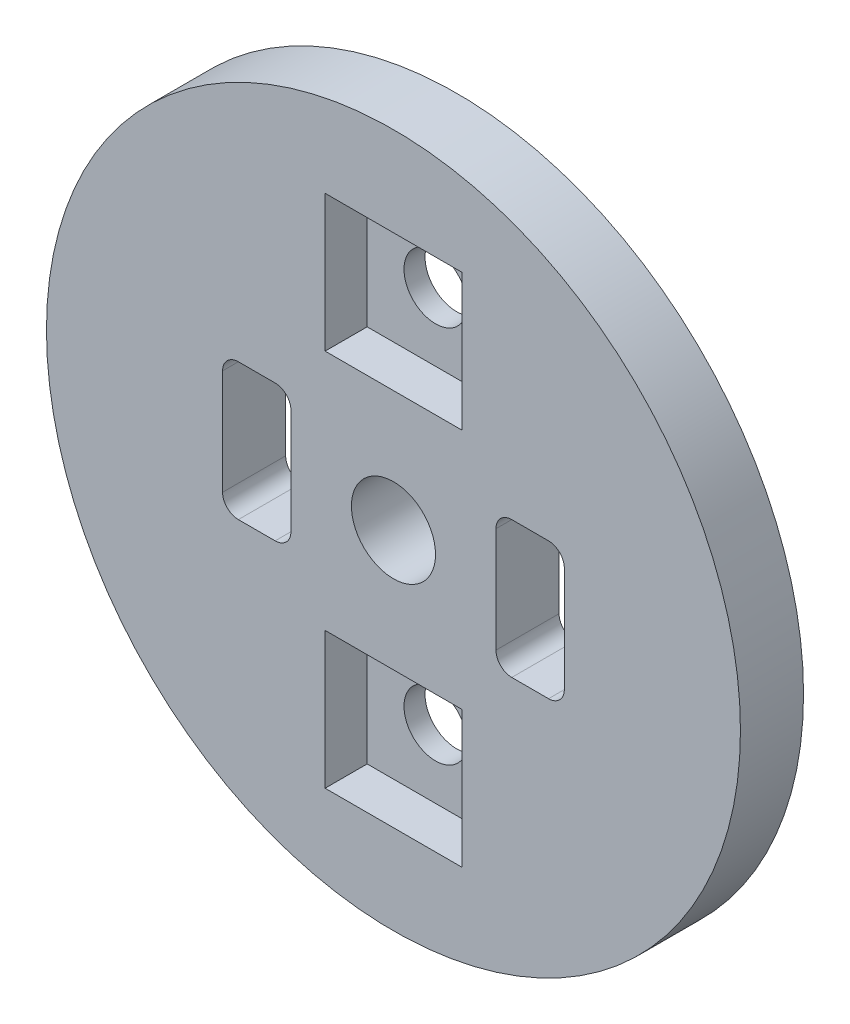
ISO-10303-21;
HEADER;
FILE_DESCRIPTION(('STEP AP214'),'2;1');
FILE_NAME('part.step','',(''),(''),'','','');
FILE_SCHEMA(('AUTOMOTIVE_DESIGN { 1 0 10303 214 1 1 1 1 }'));
ENDSEC;
DATA;
#1=APPLICATION_CONTEXT('core data for automotive mechanical design processes');
#2=APPLICATION_PROTOCOL_DEFINITION('international standard','automotive_design',2000,#1);
#3=PRODUCT_CONTEXT('',#1,'mechanical');
#4=PRODUCT('Part','Part','',(#3));
#5=PRODUCT_RELATED_PRODUCT_CATEGORY('part','',(#4));
#6=PRODUCT_DEFINITION_FORMATION('','',#4);
#7=PRODUCT_DEFINITION_CONTEXT('part definition',#1,'design');
#8=PRODUCT_DEFINITION('design','',#6,#7);
#9=PRODUCT_DEFINITION_SHAPE('','',#8);
#10=(LENGTH_UNIT() NAMED_UNIT(*) SI_UNIT(.MILLI.,.METRE.));
#11=(NAMED_UNIT(*) PLANE_ANGLE_UNIT() SI_UNIT($,.RADIAN.));
#12=(NAMED_UNIT(*) SI_UNIT($,.STERADIAN.) SOLID_ANGLE_UNIT());
#13=UNCERTAINTY_MEASURE_WITH_UNIT(LENGTH_MEASURE(1.E-05),#10,'distance_accuracy_value','');
#14=(GEOMETRIC_REPRESENTATION_CONTEXT(3) GLOBAL_UNCERTAINTY_ASSIGNED_CONTEXT((#13)) GLOBAL_UNIT_ASSIGNED_CONTEXT((#10,
#11,#12)) REPRESENTATION_CONTEXT('',''));
#15=CARTESIAN_POINT('',(0.,0.,0.));
#16=DIRECTION('',(0.,0.,1.));
#17=DIRECTION('',(1.,0.,0.));
#18=AXIS2_PLACEMENT_3D('',#15,#16,#17);
#19=CARTESIAN_POINT('',(215.7478079135,232.9520199932,3.));
#20=DIRECTION('',(0.,0.,-1.));
#21=DIRECTION('',(-1.,0.,0.));
#22=AXIS2_PLACEMENT_3D('',#19,#20,#21);
#23=CYLINDRICAL_SURFACE('',#22,1.5);
#24=CARTESIAN_POINT('',(215.7478079135,232.9520199932,0.));
#25=DIRECTION('',(0.,0.,1.));
#26=DIRECTION('',(1.,0.,0.));
#27=AXIS2_PLACEMENT_3D('',#24,#25,#26);
#28=CIRCLE('',#27,1.5);
#29=CARTESIAN_POINT('',(217.2478079135,232.9520199932,0.));
#30=VERTEX_POINT('',#29);
#31=EDGE_CURVE('E304',#30,#30,#28,.T.);
#32=ORIENTED_EDGE('',*,*,#31,.F.);
#33=EDGE_LOOP('',(#32));
#34=FACE_BOUND('',#33,.T.);
#35=CARTESIAN_POINT('',(215.7478079135,232.9520199932,1.));
#36=DIRECTION('',(0.,0.,1.));
#37=DIRECTION('',(1.,0.,0.));
#38=AXIS2_PLACEMENT_3D('',#35,#36,#37);
#39=CIRCLE('',#38,1.5);
#40=CARTESIAN_POINT('',(217.2478079135,232.9520199932,1.));
#41=VERTEX_POINT('',#40);
#42=EDGE_CURVE('E73',#41,#41,#39,.T.);
#43=ORIENTED_EDGE('',*,*,#42,.T.);
#44=EDGE_LOOP('',(#43));
#45=FACE_BOUND('',#44,.T.);
#46=ADVANCED_FACE('F69',(#34,#45),#23,.F.);
#47=CARTESIAN_POINT('',(215.7478079135,250.9520199932,3.));
#48=DIRECTION('',(0.,0.,-1.));
#49=DIRECTION('',(-1.,0.,0.));
#50=AXIS2_PLACEMENT_3D('',#47,#48,#49);
#51=CYLINDRICAL_SURFACE('',#50,1.5);
#52=CARTESIAN_POINT('',(215.7478079135,250.9520199932,0.));
#53=DIRECTION('',(0.,0.,1.));
#54=DIRECTION('',(1.,0.,0.));
#55=AXIS2_PLACEMENT_3D('',#52,#53,#54);
#56=CIRCLE('',#55,1.5);
#57=CARTESIAN_POINT('',(217.2478079135,250.9520199932,0.));
#58=VERTEX_POINT('',#57);
#59=EDGE_CURVE('E356',#58,#58,#56,.T.);
#60=ORIENTED_EDGE('',*,*,#59,.F.);
#61=EDGE_LOOP('',(#60));
#62=FACE_BOUND('',#61,.T.);
#63=CARTESIAN_POINT('',(215.7478079135,250.9520199932,1.));
#64=DIRECTION('',(0.,0.,1.));
#65=DIRECTION('',(1.,0.,0.));
#66=AXIS2_PLACEMENT_3D('',#63,#64,#65);
#67=CIRCLE('',#66,1.5);
#68=CARTESIAN_POINT('',(217.2478079135,250.9520199932,1.));
#69=VERTEX_POINT('',#68);
#70=EDGE_CURVE('E294',#69,#69,#67,.T.);
#71=ORIENTED_EDGE('',*,*,#70,.T.);
#72=EDGE_LOOP('',(#71));
#73=FACE_BOUND('',#72,.T.);
#74=ADVANCED_FACE('F71',(#62,#73),#51,.F.);
#75=CARTESIAN_POINT('',(215.7478079135,241.9520199932,3.));
#76=DIRECTION('',(0.,0.,-1.));
#77=DIRECTION('',(-1.,0.,0.));
#78=AXIS2_PLACEMENT_3D('',#75,#76,#77);
#79=CYLINDRICAL_SURFACE('',#78,16.5);
#80=CARTESIAN_POINT('',(215.7478079135,241.9520199932,3.));
#81=DIRECTION('',(0.,0.,1.));
#82=DIRECTION('',(1.,0.,0.));
#83=AXIS2_PLACEMENT_3D('',#80,#81,#82);
#84=CIRCLE('',#83,16.5);
#85=CARTESIAN_POINT('',(232.2478079135,241.9520199932,3.));
#86=VERTEX_POINT('',#85);
#87=EDGE_CURVE('E348',#86,#86,#84,.T.);
#88=ORIENTED_EDGE('',*,*,#87,.F.);
#89=EDGE_LOOP('',(#88));
#90=FACE_BOUND('',#89,.T.);
#91=CARTESIAN_POINT('',(215.7478079135,241.9520199932,0.));
#92=DIRECTION('',(0.,0.,1.));
#93=DIRECTION('',(1.,0.,0.));
#94=AXIS2_PLACEMENT_3D('',#91,#92,#93);
#95=CIRCLE('',#94,16.5);
#96=CARTESIAN_POINT('',(232.2478079135,241.9520199932,0.));
#97=VERTEX_POINT('',#96);
#98=EDGE_CURVE('E404',#97,#97,#95,.T.);
#99=ORIENTED_EDGE('',*,*,#98,.T.);
#100=EDGE_LOOP('',(#99));
#101=FACE_BOUND('',#100,.T.);
#102=ADVANCED_FACE('F477',(#90,#101),#79,.T.);
#103=CARTESIAN_POINT('',(0.,238.7020199932,3.));
#104=DIRECTION('',(0.,-1.,0.));
#105=DIRECTION('',(0.,0.,-1.));
#106=AXIS2_PLACEMENT_3D('',#103,#104,#105);
#107=PLANE('',#106);
#108=DIRECTION('',(-1.,0.,0.));
#109=VECTOR('',#108,1.);
#110=CARTESIAN_POINT('',(0.,238.7020199932,0.));
#111=LINE('',#110,#109);
#112=CARTESIAN_POINT('',(210.1228079135,238.7020199932,0.));
#113=VERTEX_POINT('',#112);
#114=CARTESIAN_POINT('',(208.3728079135,238.7020199932,0.));
#115=VERTEX_POINT('',#114);
#116=EDGE_CURVE('E383',#113,#115,#111,.T.);
#117=ORIENTED_EDGE('',*,*,#116,.T.);
#118=DIRECTION('',(0.,0.,-1.));
#119=VECTOR('',#118,1.);
#120=CARTESIAN_POINT('',(208.3728079135,238.7020199932,3.));
#121=LINE('',#120,#119);
#122=CARTESIAN_POINT('',(208.3728079135,238.7020199932,3.));
#123=VERTEX_POINT('',#122);
#124=EDGE_CURVE('E78',#123,#115,#121,.T.);
#125=ORIENTED_EDGE('',*,*,#124,.F.);
#126=DIRECTION('',(-1.,0.,0.));
#127=VECTOR('',#126,1.);
#128=CARTESIAN_POINT('',(0.,238.7020199932,3.));
#129=LINE('',#128,#127);
#130=CARTESIAN_POINT('',(210.1228079135,238.7020199932,3.));
#131=VERTEX_POINT('',#130);
#132=EDGE_CURVE('E331',#131,#123,#129,.T.);
#133=ORIENTED_EDGE('',*,*,#132,.F.);
#134=DIRECTION('',(0.,0.,-1.));
#135=VECTOR('',#134,1.);
#136=CARTESIAN_POINT('',(210.1228079135,238.7020199932,3.));
#137=LINE('',#136,#135);
#138=EDGE_CURVE('E12',#131,#113,#137,.T.);
#139=ORIENTED_EDGE('',*,*,#138,.T.);
#140=EDGE_LOOP('',(#117,#125,#133,#139));
#141=FACE_BOUND('',#140,.T.);
#142=ADVANCED_FACE('F480',(#141),#107,.F.);
#143=CARTESIAN_POINT('',(208.3728079135,239.4520199932,3.));
#144=DIRECTION('',(0.,0.,-1.));
#145=DIRECTION('',(-1.,0.,0.));
#146=AXIS2_PLACEMENT_3D('',#143,#144,#145);
#147=CYLINDRICAL_SURFACE('',#146,0.750000000000237);
#148=CARTESIAN_POINT('',(208.3728079135,239.4520199932,0.));
#149=DIRECTION('',(0.,0.,1.));
#150=DIRECTION('',(1.,0.,0.));
#151=AXIS2_PLACEMENT_3D('',#148,#149,#150);
#152=CIRCLE('',#151,0.750000000000237);
#153=CARTESIAN_POINT('',(207.6228079135,239.4520199932,0.));
#154=VERTEX_POINT('',#153);
#155=EDGE_CURVE('E386',#154,#115,#152,.T.);
#156=ORIENTED_EDGE('',*,*,#155,.F.);
#157=DIRECTION('',(0.,0.,-1.));
#158=VECTOR('',#157,1.);
#159=CARTESIAN_POINT('',(207.6228079135,239.4520199932,3.));
#160=LINE('',#159,#158);
#161=CARTESIAN_POINT('',(207.6228079135,239.4520199932,3.));
#162=VERTEX_POINT('',#161);
#163=EDGE_CURVE('E420',#162,#154,#160,.T.);
#164=ORIENTED_EDGE('',*,*,#163,.F.);
#165=CARTESIAN_POINT('',(208.3728079135,239.4520199932,3.));
#166=DIRECTION('',(0.,0.,1.));
#167=DIRECTION('',(1.,0.,0.));
#168=AXIS2_PLACEMENT_3D('',#165,#166,#167);
#169=CIRCLE('',#168,0.750000000000237);
#170=EDGE_CURVE('E333',#162,#123,#169,.T.);
#171=ORIENTED_EDGE('',*,*,#170,.T.);
#172=ORIENTED_EDGE('',*,*,#124,.T.);
#173=EDGE_LOOP('',(#156,#164,#171,#172));
#174=FACE_BOUND('',#173,.T.);
#175=ADVANCED_FACE('F523',(#174),#147,.F.);
#176=CARTESIAN_POINT('',(207.6228079135,0.,3.));
#177=DIRECTION('',(-1.,0.,0.));
#178=DIRECTION('',(0.,0.,1.));
#179=AXIS2_PLACEMENT_3D('',#176,#177,#178);
#180=PLANE('',#179);
#181=DIRECTION('',(0.,1.,0.));
#182=VECTOR('',#181,1.);
#183=CARTESIAN_POINT('',(207.6228079135,0.,0.));
#184=LINE('',#183,#182);
#185=CARTESIAN_POINT('',(207.6228079135,244.4520199932,0.));
#186=VERTEX_POINT('',#185);
#187=EDGE_CURVE('E389',#154,#186,#184,.T.);
#188=ORIENTED_EDGE('',*,*,#187,.T.);
#189=DIRECTION('',(0.,0.,-1.));
#190=VECTOR('',#189,1.);
#191=CARTESIAN_POINT('',(207.6228079135,244.4520199932,3.));
#192=LINE('',#191,#190);
#193=CARTESIAN_POINT('',(207.6228079135,244.4520199932,3.));
#194=VERTEX_POINT('',#193);
#195=EDGE_CURVE('E418',#194,#186,#192,.T.);
#196=ORIENTED_EDGE('',*,*,#195,.F.);
#197=DIRECTION('',(0.,1.,0.));
#198=VECTOR('',#197,1.);
#199=CARTESIAN_POINT('',(207.6228079135,0.,3.));
#200=LINE('',#199,#198);
#201=EDGE_CURVE('E336',#162,#194,#200,.T.);
#202=ORIENTED_EDGE('',*,*,#201,.F.);
#203=ORIENTED_EDGE('',*,*,#163,.T.);
#204=EDGE_LOOP('',(#188,#196,#202,#203));
#205=FACE_BOUND('',#204,.T.);
#206=ADVANCED_FACE('F519',(#205),#180,.F.);
#207=CARTESIAN_POINT('',(208.3728079135,244.4520199932,3.));
#208=DIRECTION('',(0.,0.,-1.));
#209=DIRECTION('',(-1.,0.,0.));
#210=AXIS2_PLACEMENT_3D('',#207,#208,#209);
#211=CYLINDRICAL_SURFACE('',#210,0.750000000000001);
#212=CARTESIAN_POINT('',(208.3728079135,244.4520199932,0.));
#213=DIRECTION('',(0.,0.,1.));
#214=DIRECTION('',(1.,0.,0.));
#215=AXIS2_PLACEMENT_3D('',#212,#213,#214);
#216=CIRCLE('',#215,0.750000000000001);
#217=CARTESIAN_POINT('',(208.3728079135,245.2020199932,0.));
#218=VERTEX_POINT('',#217);
#219=EDGE_CURVE('E392',#218,#186,#216,.T.);
#220=ORIENTED_EDGE('',*,*,#219,.F.);
#221=DIRECTION('',(0.,0.,-1.));
#222=VECTOR('',#221,1.);
#223=CARTESIAN_POINT('',(208.3728079135,245.2020199932,3.));
#224=LINE('',#223,#222);
#225=CARTESIAN_POINT('',(208.3728079135,245.2020199932,3.));
#226=VERTEX_POINT('',#225);
#227=EDGE_CURVE('E416',#226,#218,#224,.T.);
#228=ORIENTED_EDGE('',*,*,#227,.F.);
#229=CARTESIAN_POINT('',(208.3728079135,244.4520199932,3.));
#230=DIRECTION('',(0.,0.,1.));
#231=DIRECTION('',(1.,0.,0.));
#232=AXIS2_PLACEMENT_3D('',#229,#230,#231);
#233=CIRCLE('',#232,0.750000000000001);
#234=EDGE_CURVE('E338',#226,#194,#233,.T.);
#235=ORIENTED_EDGE('',*,*,#234,.T.);
#236=ORIENTED_EDGE('',*,*,#195,.T.);
#237=EDGE_LOOP('',(#220,#228,#235,#236));
#238=FACE_BOUND('',#237,.T.);
#239=ADVANCED_FACE('F515',(#238),#211,.F.);
#240=CARTESIAN_POINT('',(0.,245.2020199932,3.));
#241=DIRECTION('',(0.,1.,0.));
#242=DIRECTION('',(0.,0.,1.));
#243=AXIS2_PLACEMENT_3D('',#240,#241,#242);
#244=PLANE('',#243);
#245=DIRECTION('',(1.,0.,0.));
#246=VECTOR('',#245,1.);
#247=CARTESIAN_POINT('',(0.,245.2020199932,0.));
#248=LINE('',#247,#246);
#249=CARTESIAN_POINT('',(210.1228079135,245.2020199932,0.));
#250=VERTEX_POINT('',#249);
#251=EDGE_CURVE('E395',#218,#250,#248,.T.);
#252=ORIENTED_EDGE('',*,*,#251,.T.);
#253=DIRECTION('',(0.,0.,-1.));
#254=VECTOR('',#253,1.);
#255=CARTESIAN_POINT('',(210.1228079135,245.2020199932,3.));
#256=LINE('',#255,#254);
#257=CARTESIAN_POINT('',(210.1228079135,245.2020199932,3.));
#258=VERTEX_POINT('',#257);
#259=EDGE_CURVE('E414',#258,#250,#256,.T.);
#260=ORIENTED_EDGE('',*,*,#259,.F.);
#261=DIRECTION('',(1.,0.,0.));
#262=VECTOR('',#261,1.);
#263=CARTESIAN_POINT('',(0.,245.2020199932,3.));
#264=LINE('',#263,#262);
#265=EDGE_CURVE('E341',#226,#258,#264,.T.);
#266=ORIENTED_EDGE('',*,*,#265,.F.);
#267=ORIENTED_EDGE('',*,*,#227,.T.);
#268=EDGE_LOOP('',(#252,#260,#266,#267));
#269=FACE_BOUND('',#268,.T.);
#270=ADVANCED_FACE('F511',(#269),#244,.F.);
#271=CARTESIAN_POINT('',(210.1228079135,244.4520199932,3.));
#272=DIRECTION('',(0.,0.,-1.));
#273=DIRECTION('',(-1.,0.,0.));
#274=AXIS2_PLACEMENT_3D('',#271,#272,#273);
#275=CYLINDRICAL_SURFACE('',#274,0.750000000000001);
#276=CARTESIAN_POINT('',(210.1228079135,244.4520199932,0.));
#277=DIRECTION('',(0.,0.,1.));
#278=DIRECTION('',(1.,0.,0.));
#279=AXIS2_PLACEMENT_3D('',#276,#277,#278);
#280=CIRCLE('',#279,0.750000000000001);
#281=CARTESIAN_POINT('',(210.8728079135,244.4520199932,0.));
#282=VERTEX_POINT('',#281);
#283=EDGE_CURVE('E398',#282,#250,#280,.T.);
#284=ORIENTED_EDGE('',*,*,#283,.F.);
#285=DIRECTION('',(0.,0.,-1.));
#286=VECTOR('',#285,1.);
#287=CARTESIAN_POINT('',(210.8728079135,244.4520199932,3.));
#288=LINE('',#287,#286);
#289=CARTESIAN_POINT('',(210.8728079135,244.4520199932,3.));
#290=VERTEX_POINT('',#289);
#291=EDGE_CURVE('E411',#290,#282,#288,.T.);
#292=ORIENTED_EDGE('',*,*,#291,.F.);
#293=CARTESIAN_POINT('',(210.1228079135,244.4520199932,3.));
#294=DIRECTION('',(0.,0.,1.));
#295=DIRECTION('',(1.,0.,0.));
#296=AXIS2_PLACEMENT_3D('',#293,#294,#295);
#297=CIRCLE('',#296,0.750000000000001);
#298=EDGE_CURVE('E343',#290,#258,#297,.T.);
#299=ORIENTED_EDGE('',*,*,#298,.T.);
#300=ORIENTED_EDGE('',*,*,#259,.T.);
#301=EDGE_LOOP('',(#284,#292,#299,#300));
#302=FACE_BOUND('',#301,.T.);
#303=ADVANCED_FACE('F507',(#302),#275,.F.);
#304=CARTESIAN_POINT('',(210.8728079135,0.,3.));
#305=DIRECTION('',(1.,0.,0.));
#306=DIRECTION('',(0.,0.,-1.));
#307=AXIS2_PLACEMENT_3D('',#304,#305,#306);
#308=PLANE('',#307);
#309=DIRECTION('',(0.,-1.,0.));
#310=VECTOR('',#309,1.);
#311=CARTESIAN_POINT('',(210.8728079135,0.,0.));
#312=LINE('',#311,#310);
#313=CARTESIAN_POINT('',(210.8728079135,239.4520199932,0.));
#314=VERTEX_POINT('',#313);
#315=EDGE_CURVE('E401',#282,#314,#312,.T.);
#316=ORIENTED_EDGE('',*,*,#315,.T.);
#317=DIRECTION('',(0.,0.,-1.));
#318=VECTOR('',#317,1.);
#319=CARTESIAN_POINT('',(210.8728079135,239.4520199932,3.));
#320=LINE('',#319,#318);
#321=CARTESIAN_POINT('',(210.8728079135,239.4520199932,3.));
#322=VERTEX_POINT('',#321);
#323=EDGE_CURVE('E409',#322,#314,#320,.T.);
#324=ORIENTED_EDGE('',*,*,#323,.F.);
#325=DIRECTION('',(0.,-1.,0.));
#326=VECTOR('',#325,1.);
#327=CARTESIAN_POINT('',(210.8728079135,0.,3.));
#328=LINE('',#327,#326);
#329=EDGE_CURVE('E346',#290,#322,#328,.T.);
#330=ORIENTED_EDGE('',*,*,#329,.F.);
#331=ORIENTED_EDGE('',*,*,#291,.T.);
#332=EDGE_LOOP('',(#316,#324,#330,#331));
#333=FACE_BOUND('',#332,.T.);
#334=ADVANCED_FACE('F503',(#333),#308,.F.);
#335=CARTESIAN_POINT('',(210.1228079135,239.4520199932,3.));
#336=DIRECTION('',(0.,0.,-1.));
#337=DIRECTION('',(-1.,0.,0.));
#338=AXIS2_PLACEMENT_3D('',#335,#336,#337);
#339=CYLINDRICAL_SURFACE('',#338,0.750000000000001);
#340=CARTESIAN_POINT('',(210.1228079135,239.4520199932,0.));
#341=DIRECTION('',(0.,0.,1.));
#342=DIRECTION('',(1.,0.,0.));
#343=AXIS2_PLACEMENT_3D('',#340,#341,#342);
#344=CIRCLE('',#343,0.750000000000001);
#345=EDGE_CURVE('E380',#113,#314,#344,.T.);
#346=ORIENTED_EDGE('',*,*,#345,.F.);
#347=ORIENTED_EDGE('',*,*,#138,.F.);
#348=CARTESIAN_POINT('',(210.1228079135,239.4520199932,3.));
#349=DIRECTION('',(0.,0.,1.));
#350=DIRECTION('',(1.,0.,0.));
#351=AXIS2_PLACEMENT_3D('',#348,#349,#350);
#352=CIRCLE('',#351,0.750000000000001);
#353=EDGE_CURVE('E328',#131,#322,#352,.T.);
#354=ORIENTED_EDGE('',*,*,#353,.T.);
#355=ORIENTED_EDGE('',*,*,#323,.T.);
#356=EDGE_LOOP('',(#346,#347,#354,#355));
#357=FACE_BOUND('',#356,.T.);
#358=ADVANCED_FACE('F506',(#357),#339,.F.);
#359=CARTESIAN_POINT('',(220.6228079135,0.,3.));
#360=DIRECTION('',(1.,0.,0.));
#361=DIRECTION('',(0.,0.,-1.));
#362=AXIS2_PLACEMENT_3D('',#359,#360,#361);
#363=PLANE('',#362);
#364=DIRECTION('',(0.,-1.,0.));
#365=VECTOR('',#364,1.);
#366=CARTESIAN_POINT('',(220.6228079135,0.,0.));
#367=LINE('',#366,#365);
#368=CARTESIAN_POINT('',(220.6228079135,244.4520199932,0.));
#369=VERTEX_POINT('',#368);
#370=CARTESIAN_POINT('',(220.6228079135,239.4520199932,0.));
#371=VERTEX_POINT('',#370);
#372=EDGE_CURVE('E359',#369,#371,#367,.T.);
#373=ORIENTED_EDGE('',*,*,#372,.F.);
#374=DIRECTION('',(0.,0.,-1.));
#375=VECTOR('',#374,1.);
#376=CARTESIAN_POINT('',(220.6228079135,244.4520199932,3.));
#377=LINE('',#376,#375);
#378=CARTESIAN_POINT('',(220.6228079135,244.4520199932,3.));
#379=VERTEX_POINT('',#378);
#380=EDGE_CURVE('E434',#379,#369,#377,.T.);
#381=ORIENTED_EDGE('',*,*,#380,.F.);
#382=DIRECTION('',(0.,-1.,0.));
#383=VECTOR('',#382,1.);
#384=CARTESIAN_POINT('',(220.6228079135,0.,3.));
#385=LINE('',#384,#383);
#386=CARTESIAN_POINT('',(220.6228079135,239.4520199932,3.));
#387=VERTEX_POINT('',#386);
#388=EDGE_CURVE('E307',#379,#387,#385,.T.);
#389=ORIENTED_EDGE('',*,*,#388,.T.);
#390=DIRECTION('',(0.,0.,-1.));
#391=VECTOR('',#390,1.);
#392=CARTESIAN_POINT('',(220.6228079135,239.4520199932,3.));
#393=LINE('',#392,#391);
#394=EDGE_CURVE('E412',#387,#371,#393,.T.);
#395=ORIENTED_EDGE('',*,*,#394,.T.);
#396=EDGE_LOOP('',(#373,#381,#389,#395));
#397=FACE_BOUND('',#396,.T.);
#398=ADVANCED_FACE('F533',(#397),#363,.T.);
#399=CARTESIAN_POINT('',(221.3728079135,244.4520199932,3.));
#400=DIRECTION('',(0.,0.,-1.));
#401=DIRECTION('',(-1.,0.,0.));
#402=AXIS2_PLACEMENT_3D('',#399,#400,#401);
#403=CYLINDRICAL_SURFACE('',#402,0.750000000000001);
#404=CARTESIAN_POINT('',(221.3728079135,244.4520199932,0.));
#405=DIRECTION('',(0.,0.,1.));
#406=DIRECTION('',(1.,0.,0.));
#407=AXIS2_PLACEMENT_3D('',#404,#405,#406);
#408=CIRCLE('',#407,0.750000000000001);
#409=CARTESIAN_POINT('',(221.3728079135,245.2020199932,0.));
#410=VERTEX_POINT('',#409);
#411=EDGE_CURVE('E362',#410,#369,#408,.T.);
#412=ORIENTED_EDGE('',*,*,#411,.F.);
#413=DIRECTION('',(0.,0.,-1.));
#414=VECTOR('',#413,1.);
#415=CARTESIAN_POINT('',(221.3728079135,245.2020199932,3.));
#416=LINE('',#415,#414);
#417=CARTESIAN_POINT('',(221.3728079135,245.2020199932,3.));
#418=VERTEX_POINT('',#417);
#419=EDGE_CURVE('E432',#418,#410,#416,.T.);
#420=ORIENTED_EDGE('',*,*,#419,.F.);
#421=CARTESIAN_POINT('',(221.3728079135,244.4520199932,3.));
#422=DIRECTION('',(0.,0.,1.));
#423=DIRECTION('',(1.,0.,0.));
#424=AXIS2_PLACEMENT_3D('',#421,#422,#423);
#425=CIRCLE('',#424,0.750000000000001);
#426=EDGE_CURVE('E310',#418,#379,#425,.T.);
#427=ORIENTED_EDGE('',*,*,#426,.T.);
#428=ORIENTED_EDGE('',*,*,#380,.T.);
#429=EDGE_LOOP('',(#412,#420,#427,#428));
#430=FACE_BOUND('',#429,.T.);
#431=ADVANCED_FACE('F555',(#430),#403,.F.);
#432=CARTESIAN_POINT('',(0.,245.2020199932,3.));
#433=DIRECTION('',(0.,-1.,0.));
#434=DIRECTION('',(0.,0.,-1.));
#435=AXIS2_PLACEMENT_3D('',#432,#433,#434);
#436=PLANE('',#435);
#437=DIRECTION('',(-1.,0.,0.));
#438=VECTOR('',#437,1.);
#439=CARTESIAN_POINT('',(0.,245.2020199932,0.));
#440=LINE('',#439,#438);
#441=CARTESIAN_POINT('',(223.1228079135,245.2020199932,0.));
#442=VERTEX_POINT('',#441);
#443=EDGE_CURVE('E365',#442,#410,#440,.T.);
#444=ORIENTED_EDGE('',*,*,#443,.F.);
#445=DIRECTION('',(0.,0.,-1.));
#446=VECTOR('',#445,1.);
#447=CARTESIAN_POINT('',(223.1228079135,245.2020199932,3.));
#448=LINE('',#447,#446);
#449=CARTESIAN_POINT('',(223.1228079135,245.2020199932,3.));
#450=VERTEX_POINT('',#449);
#451=EDGE_CURVE('E430',#450,#442,#448,.T.);
#452=ORIENTED_EDGE('',*,*,#451,.F.);
#453=DIRECTION('',(-1.,0.,0.));
#454=VECTOR('',#453,1.);
#455=CARTESIAN_POINT('',(0.,245.2020199932,3.));
#456=LINE('',#455,#454);
#457=EDGE_CURVE('E313',#450,#418,#456,.T.);
#458=ORIENTED_EDGE('',*,*,#457,.T.);
#459=ORIENTED_EDGE('',*,*,#419,.T.);
#460=EDGE_LOOP('',(#444,#452,#458,#459));
#461=FACE_BOUND('',#460,.T.);
#462=ADVANCED_FACE('F551',(#461),#436,.T.);
#463=CARTESIAN_POINT('',(223.1228079135,244.4520199932,3.));
#464=DIRECTION('',(0.,0.,-1.));
#465=DIRECTION('',(-1.,0.,0.));
#466=AXIS2_PLACEMENT_3D('',#463,#464,#465);
#467=CYLINDRICAL_SURFACE('',#466,0.750000000000001);
#468=CARTESIAN_POINT('',(223.1228079135,244.4520199932,0.));
#469=DIRECTION('',(0.,0.,1.));
#470=DIRECTION('',(1.,0.,0.));
#471=AXIS2_PLACEMENT_3D('',#468,#469,#470);
#472=CIRCLE('',#471,0.750000000000001);
#473=CARTESIAN_POINT('',(223.8728079135,244.4520199932,0.));
#474=VERTEX_POINT('',#473);
#475=EDGE_CURVE('E368',#474,#442,#472,.T.);
#476=ORIENTED_EDGE('',*,*,#475,.F.);
#477=DIRECTION('',(0.,0.,-1.));
#478=VECTOR('',#477,1.);
#479=CARTESIAN_POINT('',(223.8728079135,244.4520199932,3.));
#480=LINE('',#479,#478);
#481=CARTESIAN_POINT('',(223.8728079135,244.4520199932,3.));
#482=VERTEX_POINT('',#481);
#483=EDGE_CURVE('E428',#482,#474,#480,.T.);
#484=ORIENTED_EDGE('',*,*,#483,.F.);
#485=CARTESIAN_POINT('',(223.1228079135,244.4520199932,3.));
#486=DIRECTION('',(0.,0.,1.));
#487=DIRECTION('',(1.,0.,0.));
#488=AXIS2_PLACEMENT_3D('',#485,#486,#487);
#489=CIRCLE('',#488,0.750000000000001);
#490=EDGE_CURVE('E316',#482,#450,#489,.T.);
#491=ORIENTED_EDGE('',*,*,#490,.T.);
#492=ORIENTED_EDGE('',*,*,#451,.T.);
#493=EDGE_LOOP('',(#476,#484,#491,#492));
#494=FACE_BOUND('',#493,.T.);
#495=ADVANCED_FACE('F547',(#494),#467,.F.);
#496=CARTESIAN_POINT('',(223.8728079135,0.,3.));
#497=DIRECTION('',(-1.,0.,0.));
#498=DIRECTION('',(0.,0.,1.));
#499=AXIS2_PLACEMENT_3D('',#496,#497,#498);
#500=PLANE('',#499);
#501=DIRECTION('',(0.,1.,0.));
#502=VECTOR('',#501,1.);
#503=CARTESIAN_POINT('',(223.8728079135,0.,0.));
#504=LINE('',#503,#502);
#505=CARTESIAN_POINT('',(223.8728079135,239.4520199932,0.));
#506=VERTEX_POINT('',#505);
#507=EDGE_CURVE('E371',#506,#474,#504,.T.);
#508=ORIENTED_EDGE('',*,*,#507,.F.);
#509=DIRECTION('',(0.,0.,-1.));
#510=VECTOR('',#509,1.);
#511=CARTESIAN_POINT('',(223.8728079135,239.4520199932,3.));
#512=LINE('',#511,#510);
#513=CARTESIAN_POINT('',(223.8728079135,239.4520199932,3.));
#514=VERTEX_POINT('',#513);
#515=EDGE_CURVE('E426',#514,#506,#512,.T.);
#516=ORIENTED_EDGE('',*,*,#515,.F.);
#517=DIRECTION('',(0.,1.,0.));
#518=VECTOR('',#517,1.);
#519=CARTESIAN_POINT('',(223.8728079135,0.,3.));
#520=LINE('',#519,#518);
#521=EDGE_CURVE('E319',#514,#482,#520,.T.);
#522=ORIENTED_EDGE('',*,*,#521,.T.);
#523=ORIENTED_EDGE('',*,*,#483,.T.);
#524=EDGE_LOOP('',(#508,#516,#522,#523));
#525=FACE_BOUND('',#524,.T.);
#526=ADVANCED_FACE('F543',(#525),#500,.T.);
#527=CARTESIAN_POINT('',(223.1228079135,239.4520199932,3.));
#528=DIRECTION('',(0.,0.,-1.));
#529=DIRECTION('',(-1.,0.,0.));
#530=AXIS2_PLACEMENT_3D('',#527,#528,#529);
#531=CYLINDRICAL_SURFACE('',#530,0.750000000000001);
#532=CARTESIAN_POINT('',(223.1228079135,239.4520199932,0.));
#533=DIRECTION('',(0.,0.,1.));
#534=DIRECTION('',(1.,0.,0.));
#535=AXIS2_PLACEMENT_3D('',#532,#533,#534);
#536=CIRCLE('',#535,0.750000000000001);
#537=CARTESIAN_POINT('',(223.1228079135,238.7020199932,0.));
#538=VERTEX_POINT('',#537);
#539=EDGE_CURVE('E374',#538,#506,#536,.T.);
#540=ORIENTED_EDGE('',*,*,#539,.F.);
#541=DIRECTION('',(0.,0.,-1.));
#542=VECTOR('',#541,1.);
#543=CARTESIAN_POINT('',(223.1228079135,238.7020199932,3.));
#544=LINE('',#543,#542);
#545=CARTESIAN_POINT('',(223.1228079135,238.7020199932,3.));
#546=VERTEX_POINT('',#545);
#547=EDGE_CURVE('E424',#546,#538,#544,.T.);
#548=ORIENTED_EDGE('',*,*,#547,.F.);
#549=CARTESIAN_POINT('',(223.1228079135,239.4520199932,3.));
#550=DIRECTION('',(0.,0.,1.));
#551=DIRECTION('',(1.,0.,0.));
#552=AXIS2_PLACEMENT_3D('',#549,#550,#551);
#553=CIRCLE('',#552,0.750000000000001);
#554=EDGE_CURVE('E322',#546,#514,#553,.T.);
#555=ORIENTED_EDGE('',*,*,#554,.T.);
#556=ORIENTED_EDGE('',*,*,#515,.T.);
#557=EDGE_LOOP('',(#540,#548,#555,#556));
#558=FACE_BOUND('',#557,.T.);
#559=ADVANCED_FACE('F539',(#558),#531,.F.);
#560=CARTESIAN_POINT('',(0.,238.7020199932,3.));
#561=DIRECTION('',(0.,1.,0.));
#562=DIRECTION('',(0.,0.,1.));
#563=AXIS2_PLACEMENT_3D('',#560,#561,#562);
#564=PLANE('',#563);
#565=DIRECTION('',(1.,0.,0.));
#566=VECTOR('',#565,1.);
#567=CARTESIAN_POINT('',(0.,238.7020199932,0.));
#568=LINE('',#567,#566);
#569=CARTESIAN_POINT('',(221.3728079135,238.7020199932,0.));
#570=VERTEX_POINT('',#569);
#571=EDGE_CURVE('E377',#570,#538,#568,.T.);
#572=ORIENTED_EDGE('',*,*,#571,.F.);
#573=DIRECTION('',(0.,0.,-1.));
#574=VECTOR('',#573,1.);
#575=CARTESIAN_POINT('',(221.3728079135,238.7020199932,3.));
#576=LINE('',#575,#574);
#577=CARTESIAN_POINT('',(221.3728079135,238.7020199932,3.));
#578=VERTEX_POINT('',#577);
#579=EDGE_CURVE('E351',#578,#570,#576,.T.);
#580=ORIENTED_EDGE('',*,*,#579,.F.);
#581=DIRECTION('',(1.,0.,0.));
#582=VECTOR('',#581,1.);
#583=CARTESIAN_POINT('',(0.,238.7020199932,3.));
#584=LINE('',#583,#582);
#585=EDGE_CURVE('E325',#578,#546,#584,.T.);
#586=ORIENTED_EDGE('',*,*,#585,.T.);
#587=ORIENTED_EDGE('',*,*,#547,.T.);
#588=EDGE_LOOP('',(#572,#580,#586,#587));
#589=FACE_BOUND('',#588,.T.);
#590=ADVANCED_FACE('F535',(#589),#564,.T.);
#591=CARTESIAN_POINT('',(221.3728079135,239.4520199932,3.));
#592=DIRECTION('',(0.,0.,-1.));
#593=DIRECTION('',(-1.,0.,0.));
#594=AXIS2_PLACEMENT_3D('',#591,#592,#593);
#595=CYLINDRICAL_SURFACE('',#594,0.750000000000001);
#596=CARTESIAN_POINT('',(221.3728079135,239.4520199932,0.));
#597=DIRECTION('',(0.,0.,1.));
#598=DIRECTION('',(1.,0.,0.));
#599=AXIS2_PLACEMENT_3D('',#596,#597,#598);
#600=CIRCLE('',#599,0.750000000000001);
#601=EDGE_CURVE('E355',#371,#570,#600,.T.);
#602=ORIENTED_EDGE('',*,*,#601,.F.);
#603=ORIENTED_EDGE('',*,*,#394,.F.);
#604=CARTESIAN_POINT('',(221.3728079135,239.4520199932,3.));
#605=DIRECTION('',(0.,0.,1.));
#606=DIRECTION('',(1.,0.,0.));
#607=AXIS2_PLACEMENT_3D('',#604,#605,#606);
#608=CIRCLE('',#607,0.750000000000001);
#609=EDGE_CURVE('E303',#387,#578,#608,.T.);
#610=ORIENTED_EDGE('',*,*,#609,.T.);
#611=ORIENTED_EDGE('',*,*,#579,.T.);
#612=EDGE_LOOP('',(#602,#603,#610,#611));
#613=FACE_BOUND('',#612,.T.);
#614=ADVANCED_FACE('F538',(#613),#595,.F.);
#615=CARTESIAN_POINT('',(215.7478079135,241.9520199932,3.));
#616=DIRECTION('',(0.,0.,-1.));
#617=DIRECTION('',(-1.,0.,0.));
#618=AXIS2_PLACEMENT_3D('',#615,#616,#617);
#619=CYLINDRICAL_SURFACE('',#618,2.);
#620=CARTESIAN_POINT('',(215.7478079135,241.9520199932,3.));
#621=DIRECTION('',(0.,0.,1.));
#622=DIRECTION('',(1.,0.,0.));
#623=AXIS2_PLACEMENT_3D('',#620,#621,#622);
#624=CIRCLE('',#623,2.);
#625=CARTESIAN_POINT('',(217.7478079135,241.9520199932,3.));
#626=VERTEX_POINT('',#625);
#627=EDGE_CURVE('E300',#626,#626,#624,.T.);
#628=ORIENTED_EDGE('',*,*,#627,.T.);
#629=EDGE_LOOP('',(#628));
#630=FACE_BOUND('',#629,.T.);
#631=CARTESIAN_POINT('',(215.7478079135,241.9520199932,0.));
#632=DIRECTION('',(0.,0.,1.));
#633=DIRECTION('',(1.,0.,0.));
#634=AXIS2_PLACEMENT_3D('',#631,#632,#633);
#635=CIRCLE('',#634,2.);
#636=CARTESIAN_POINT('',(217.7478079135,241.9520199932,0.));
#637=VERTEX_POINT('',#636);
#638=EDGE_CURVE('E352',#637,#637,#635,.T.);
#639=ORIENTED_EDGE('',*,*,#638,.F.);
#640=EDGE_LOOP('',(#639));
#641=FACE_BOUND('',#640,.T.);
#642=ADVANCED_FACE('F486',(#630,#641),#619,.F.);
#643=CARTESIAN_POINT('',(0.,0.,0.));
#644=DIRECTION('',(0.,0.,1.));
#645=DIRECTION('',(1.,0.,0.));
#646=AXIS2_PLACEMENT_3D('',#643,#644,#645);
#647=PLANE('',#646);
#648=ORIENTED_EDGE('',*,*,#638,.T.);
#649=EDGE_LOOP('',(#648));
#650=FACE_BOUND('',#649,.T.);
#651=ORIENTED_EDGE('',*,*,#601,.T.);
#652=ORIENTED_EDGE('',*,*,#571,.T.);
#653=ORIENTED_EDGE('',*,*,#539,.T.);
#654=ORIENTED_EDGE('',*,*,#507,.T.);
#655=ORIENTED_EDGE('',*,*,#475,.T.);
#656=ORIENTED_EDGE('',*,*,#443,.T.);
#657=ORIENTED_EDGE('',*,*,#411,.T.);
#658=ORIENTED_EDGE('',*,*,#372,.T.);
#659=EDGE_LOOP('',(#651,#652,#653,#654,#655,#656,#657,#658));
#660=FACE_BOUND('',#659,.T.);
#661=ORIENTED_EDGE('',*,*,#345,.T.);
#662=ORIENTED_EDGE('',*,*,#315,.F.);
#663=ORIENTED_EDGE('',*,*,#283,.T.);
#664=ORIENTED_EDGE('',*,*,#251,.F.);
#665=ORIENTED_EDGE('',*,*,#219,.T.);
#666=ORIENTED_EDGE('',*,*,#187,.F.);
#667=ORIENTED_EDGE('',*,*,#155,.T.);
#668=ORIENTED_EDGE('',*,*,#116,.F.);
#669=EDGE_LOOP('',(#661,#662,#663,#664,#665,#666,#667,#668));
#670=FACE_BOUND('',#669,.T.);
#671=ORIENTED_EDGE('',*,*,#98,.F.);
#672=EDGE_LOOP('',(#671));
#673=FACE_BOUND('',#672,.T.);
#674=ORIENTED_EDGE('',*,*,#31,.T.);
#675=EDGE_LOOP('',(#674));
#676=FACE_BOUND('',#675,.T.);
#677=ORIENTED_EDGE('',*,*,#59,.T.);
#678=EDGE_LOOP('',(#677));
#679=FACE_BOUND('',#678,.T.);
#680=ADVANCED_FACE('F464',(#650,#660,#670,#673,#676,#679),#647,.F.);
#681=CARTESIAN_POINT('',(0.,0.,3.));
#682=DIRECTION('',(0.,0.,1.));
#683=DIRECTION('',(1.,0.,0.));
#684=AXIS2_PLACEMENT_3D('',#681,#682,#683);
#685=PLANE('',#684);
#686=DIRECTION('',(0.,1.,0.));
#687=VECTOR('',#686,1.);
#688=CARTESIAN_POINT('',(218.9978079135,236.2020199932,3.));
#689=LINE('',#688,#687);
#690=CARTESIAN_POINT('',(218.9978079135,229.7020199932,3.));
#691=VERTEX_POINT('',#690);
#692=CARTESIAN_POINT('',(218.9978079135,236.2020199932,3.));
#693=VERTEX_POINT('',#692);
#694=EDGE_CURVE('E86',#691,#693,#689,.T.);
#695=ORIENTED_EDGE('',*,*,#694,.F.);
#696=DIRECTION('',(1.,0.,0.));
#697=VECTOR('',#696,1.);
#698=CARTESIAN_POINT('',(212.4978079135,229.7020199932,3.));
#699=LINE('',#698,#697);
#700=CARTESIAN_POINT('',(212.4978079135,229.7020199932,3.));
#701=VERTEX_POINT('',#700);
#702=EDGE_CURVE('E251',#701,#691,#699,.T.);
#703=ORIENTED_EDGE('',*,*,#702,.F.);
#704=DIRECTION('',(0.,-1.,0.));
#705=VECTOR('',#704,1.);
#706=CARTESIAN_POINT('',(212.4978079135,236.2020199932,3.));
#707=LINE('',#706,#705);
#708=CARTESIAN_POINT('',(212.4978079135,236.2020199932,3.));
#709=VERTEX_POINT('',#708);
#710=EDGE_CURVE('E254',#709,#701,#707,.T.);
#711=ORIENTED_EDGE('',*,*,#710,.F.);
#712=DIRECTION('',(-1.,0.,0.));
#713=VECTOR('',#712,1.);
#714=CARTESIAN_POINT('',(212.4978079135,236.2020199932,3.));
#715=LINE('',#714,#713);
#716=EDGE_CURVE('E260',#693,#709,#715,.T.);
#717=ORIENTED_EDGE('',*,*,#716,.F.);
#718=EDGE_LOOP('',(#695,#703,#711,#717));
#719=FACE_BOUND('',#718,.T.);
#720=DIRECTION('',(0.,1.,0.));
#721=VECTOR('',#720,1.);
#722=CARTESIAN_POINT('',(218.9978079135,254.2020199932,3.));
#723=LINE('',#722,#721);
#724=CARTESIAN_POINT('',(218.9978079135,247.7020199932,3.));
#725=VERTEX_POINT('',#724);
#726=CARTESIAN_POINT('',(218.9978079135,254.2020199932,3.));
#727=VERTEX_POINT('',#726);
#728=EDGE_CURVE('E94',#725,#727,#723,.T.);
#729=ORIENTED_EDGE('',*,*,#728,.F.);
#730=DIRECTION('',(1.,0.,0.));
#731=VECTOR('',#730,1.);
#732=CARTESIAN_POINT('',(212.4978079135,247.7020199932,3.));
#733=LINE('',#732,#731);
#734=CARTESIAN_POINT('',(212.4978079135,247.7020199932,3.));
#735=VERTEX_POINT('',#734);
#736=EDGE_CURVE('E273',#735,#725,#733,.T.);
#737=ORIENTED_EDGE('',*,*,#736,.F.);
#738=DIRECTION('',(0.,-1.,0.));
#739=VECTOR('',#738,1.);
#740=CARTESIAN_POINT('',(212.4978079135,254.2020199932,3.));
#741=LINE('',#740,#739);
#742=CARTESIAN_POINT('',(212.4978079135,254.2020199932,3.));
#743=VERTEX_POINT('',#742);
#744=EDGE_CURVE('E287',#743,#735,#741,.T.);
#745=ORIENTED_EDGE('',*,*,#744,.F.);
#746=DIRECTION('',(-1.,0.,0.));
#747=VECTOR('',#746,1.);
#748=CARTESIAN_POINT('',(212.4978079135,254.2020199932,3.));
#749=LINE('',#748,#747);
#750=EDGE_CURVE('E284',#727,#743,#749,.T.);
#751=ORIENTED_EDGE('',*,*,#750,.F.);
#752=EDGE_LOOP('',(#729,#737,#745,#751));
#753=FACE_BOUND('',#752,.T.);
#754=ORIENTED_EDGE('',*,*,#627,.F.);
#755=EDGE_LOOP('',(#754));
#756=FACE_BOUND('',#755,.T.);
#757=ORIENTED_EDGE('',*,*,#609,.F.);
#758=ORIENTED_EDGE('',*,*,#388,.F.);
#759=ORIENTED_EDGE('',*,*,#426,.F.);
#760=ORIENTED_EDGE('',*,*,#457,.F.);
#761=ORIENTED_EDGE('',*,*,#490,.F.);
#762=ORIENTED_EDGE('',*,*,#521,.F.);
#763=ORIENTED_EDGE('',*,*,#554,.F.);
#764=ORIENTED_EDGE('',*,*,#585,.F.);
#765=EDGE_LOOP('',(#757,#758,#759,#760,#761,#762,#763,#764));
#766=FACE_BOUND('',#765,.T.);
#767=ORIENTED_EDGE('',*,*,#353,.F.);
#768=ORIENTED_EDGE('',*,*,#132,.T.);
#769=ORIENTED_EDGE('',*,*,#170,.F.);
#770=ORIENTED_EDGE('',*,*,#201,.T.);
#771=ORIENTED_EDGE('',*,*,#234,.F.);
#772=ORIENTED_EDGE('',*,*,#265,.T.);
#773=ORIENTED_EDGE('',*,*,#298,.F.);
#774=ORIENTED_EDGE('',*,*,#329,.T.);
#775=EDGE_LOOP('',(#767,#768,#769,#770,#771,#772,#773,#774));
#776=FACE_BOUND('',#775,.T.);
#777=ORIENTED_EDGE('',*,*,#87,.T.);
#778=EDGE_LOOP('',(#777));
#779=FACE_BOUND('',#778,.T.);
#780=ADVANCED_FACE('F461',(#719,#753,#756,#766,#776,#779),#685,.T.);
#781=CARTESIAN_POINT('',(218.9978079135,254.2020199932,1.));
#782=DIRECTION('',(1.,0.,0.));
#783=DIRECTION('',(0.,0.,-1.));
#784=AXIS2_PLACEMENT_3D('',#781,#782,#783);
#785=PLANE('',#784);
#786=ORIENTED_EDGE('',*,*,#728,.T.);
#787=DIRECTION('',(0.,0.,1.));
#788=VECTOR('',#787,1.);
#789=CARTESIAN_POINT('',(218.9978079135,254.2020199932,1.));
#790=LINE('',#789,#788);
#791=CARTESIAN_POINT('',(218.9978079135,254.2020199932,1.));
#792=VERTEX_POINT('',#791);
#793=EDGE_CURVE('E282',#792,#727,#790,.T.);
#794=ORIENTED_EDGE('',*,*,#793,.F.);
#795=DIRECTION('',(0.,1.,0.));
#796=VECTOR('',#795,1.);
#797=CARTESIAN_POINT('',(218.9978079135,254.2020199932,1.));
#798=LINE('',#797,#796);
#799=CARTESIAN_POINT('',(218.9978079135,247.7020199932,1.));
#800=VERTEX_POINT('',#799);
#801=EDGE_CURVE('E269',#800,#792,#798,.T.);
#802=ORIENTED_EDGE('',*,*,#801,.F.);
#803=DIRECTION('',(0.,0.,1.));
#804=VECTOR('',#803,1.);
#805=CARTESIAN_POINT('',(218.9978079135,247.7020199932,1.));
#806=LINE('',#805,#804);
#807=EDGE_CURVE('E292',#800,#725,#806,.T.);
#808=ORIENTED_EDGE('',*,*,#807,.T.);
#809=EDGE_LOOP('',(#786,#794,#802,#808));
#810=FACE_BOUND('',#809,.T.);
#811=ADVANCED_FACE('F450',(#810),#785,.F.);
#812=CARTESIAN_POINT('',(212.4978079135,247.7020199932,1.));
#813=DIRECTION('',(0.,-1.,0.));
#814=DIRECTION('',(0.,0.,-1.));
#815=AXIS2_PLACEMENT_3D('',#812,#813,#814);
#816=PLANE('',#815);
#817=ORIENTED_EDGE('',*,*,#736,.T.);
#818=ORIENTED_EDGE('',*,*,#807,.F.);
#819=DIRECTION('',(1.,0.,0.));
#820=VECTOR('',#819,1.);
#821=CARTESIAN_POINT('',(212.4978079135,247.7020199932,1.));
#822=LINE('',#821,#820);
#823=CARTESIAN_POINT('',(212.4978079135,247.7020199932,1.));
#824=VERTEX_POINT('',#823);
#825=EDGE_CURVE('E279',#824,#800,#822,.T.);
#826=ORIENTED_EDGE('',*,*,#825,.F.);
#827=DIRECTION('',(0.,0.,1.));
#828=VECTOR('',#827,1.);
#829=CARTESIAN_POINT('',(212.4978079135,247.7020199932,1.));
#830=LINE('',#829,#828);
#831=EDGE_CURVE('E295',#824,#735,#830,.T.);
#832=ORIENTED_EDGE('',*,*,#831,.T.);
#833=EDGE_LOOP('',(#817,#818,#826,#832));
#834=FACE_BOUND('',#833,.T.);
#835=ADVANCED_FACE('F458',(#834),#816,.F.);
#836=CARTESIAN_POINT('',(212.4978079135,254.2020199932,1.));
#837=DIRECTION('',(-1.,0.,0.));
#838=DIRECTION('',(0.,0.,1.));
#839=AXIS2_PLACEMENT_3D('',#836,#837,#838);
#840=PLANE('',#839);
#841=ORIENTED_EDGE('',*,*,#744,.T.);
#842=ORIENTED_EDGE('',*,*,#831,.F.);
#843=DIRECTION('',(0.,-1.,0.));
#844=VECTOR('',#843,1.);
#845=CARTESIAN_POINT('',(212.4978079135,254.2020199932,1.));
#846=LINE('',#845,#844);
#847=CARTESIAN_POINT('',(212.4978079135,254.2020199932,1.));
#848=VERTEX_POINT('',#847);
#849=EDGE_CURVE('E276',#848,#824,#846,.T.);
#850=ORIENTED_EDGE('',*,*,#849,.F.);
#851=DIRECTION('',(0.,0.,1.));
#852=VECTOR('',#851,1.);
#853=CARTESIAN_POINT('',(212.4978079135,254.2020199932,1.));
#854=LINE('',#853,#852);
#855=EDGE_CURVE('E297',#848,#743,#854,.T.);
#856=ORIENTED_EDGE('',*,*,#855,.T.);
#857=EDGE_LOOP('',(#841,#842,#850,#856));
#858=FACE_BOUND('',#857,.T.);
#859=ADVANCED_FACE('F456',(#858),#840,.F.);
#860=CARTESIAN_POINT('',(212.4978079135,254.2020199932,1.));
#861=DIRECTION('',(0.,1.,0.));
#862=DIRECTION('',(0.,0.,1.));
#863=AXIS2_PLACEMENT_3D('',#860,#861,#862);
#864=PLANE('',#863);
#865=ORIENTED_EDGE('',*,*,#750,.T.);
#866=ORIENTED_EDGE('',*,*,#855,.F.);
#867=DIRECTION('',(-1.,0.,0.));
#868=VECTOR('',#867,1.);
#869=CARTESIAN_POINT('',(212.4978079135,254.2020199932,1.));
#870=LINE('',#869,#868);
#871=EDGE_CURVE('E272',#792,#848,#870,.T.);
#872=ORIENTED_EDGE('',*,*,#871,.F.);
#873=ORIENTED_EDGE('',*,*,#793,.T.);
#874=EDGE_LOOP('',(#865,#866,#872,#873));
#875=FACE_BOUND('',#874,.T.);
#876=ADVANCED_FACE('F445',(#875),#864,.F.);
#877=CARTESIAN_POINT('',(0.,0.,1.));
#878=DIRECTION('',(0.,0.,1.));
#879=DIRECTION('',(1.,0.,0.));
#880=AXIS2_PLACEMENT_3D('',#877,#878,#879);
#881=PLANE('',#880);
#882=ORIENTED_EDGE('',*,*,#70,.F.);
#883=EDGE_LOOP('',(#882));
#884=FACE_BOUND('',#883,.T.);
#885=ORIENTED_EDGE('',*,*,#801,.T.);
#886=ORIENTED_EDGE('',*,*,#871,.T.);
#887=ORIENTED_EDGE('',*,*,#849,.T.);
#888=ORIENTED_EDGE('',*,*,#825,.T.);
#889=EDGE_LOOP('',(#885,#886,#887,#888));
#890=FACE_BOUND('',#889,.T.);
#891=ADVANCED_FACE('F442',(#884,#890),#881,.T.);
#892=CARTESIAN_POINT('',(218.9978079135,236.2020199932,1.));
#893=DIRECTION('',(1.,0.,0.));
#894=DIRECTION('',(0.,0.,-1.));
#895=AXIS2_PLACEMENT_3D('',#892,#893,#894);
#896=PLANE('',#895);
#897=ORIENTED_EDGE('',*,*,#694,.T.);
#898=DIRECTION('',(0.,0.,1.));
#899=VECTOR('',#898,1.);
#900=CARTESIAN_POINT('',(218.9978079135,236.2020199932,1.));
#901=LINE('',#900,#899);
#902=CARTESIAN_POINT('',(218.9978079135,236.2020199932,1.));
#903=VERTEX_POINT('',#902);
#904=EDGE_CURVE('E229',#903,#693,#901,.T.);
#905=ORIENTED_EDGE('',*,*,#904,.F.);
#906=DIRECTION('',(0.,1.,0.));
#907=VECTOR('',#906,1.);
#908=CARTESIAN_POINT('',(218.9978079135,236.2020199932,1.));
#909=LINE('',#908,#907);
#910=CARTESIAN_POINT('',(218.9978079135,229.7020199932,1.));
#911=VERTEX_POINT('',#910);
#912=EDGE_CURVE('E233',#911,#903,#909,.T.);
#913=ORIENTED_EDGE('',*,*,#912,.F.);
#914=DIRECTION('',(0.,0.,1.));
#915=VECTOR('',#914,1.);
#916=CARTESIAN_POINT('',(218.9978079135,229.7020199932,1.));
#917=LINE('',#916,#915);
#918=EDGE_CURVE('E264',#911,#691,#917,.T.);
#919=ORIENTED_EDGE('',*,*,#918,.T.);
#920=EDGE_LOOP('',(#897,#905,#913,#919));
#921=FACE_BOUND('',#920,.T.);
#922=ADVANCED_FACE('F231',(#921),#896,.F.);
#923=CARTESIAN_POINT('',(212.4978079135,229.7020199932,1.));
#924=DIRECTION('',(0.,-1.,0.));
#925=DIRECTION('',(0.,0.,-1.));
#926=AXIS2_PLACEMENT_3D('',#923,#924,#925);
#927=PLANE('',#926);
#928=ORIENTED_EDGE('',*,*,#702,.T.);
#929=ORIENTED_EDGE('',*,*,#918,.F.);
#930=DIRECTION('',(1.,0.,0.));
#931=VECTOR('',#930,1.);
#932=CARTESIAN_POINT('',(212.4978079135,229.7020199932,1.));
#933=LINE('',#932,#931);
#934=CARTESIAN_POINT('',(212.4978079135,229.7020199932,1.));
#935=VERTEX_POINT('',#934);
#936=EDGE_CURVE('E239',#935,#911,#933,.T.);
#937=ORIENTED_EDGE('',*,*,#936,.F.);
#938=DIRECTION('',(0.,0.,1.));
#939=VECTOR('',#938,1.);
#940=CARTESIAN_POINT('',(212.4978079135,229.7020199932,1.));
#941=LINE('',#940,#939);
#942=EDGE_CURVE('E266',#935,#701,#941,.T.);
#943=ORIENTED_EDGE('',*,*,#942,.T.);
#944=EDGE_LOOP('',(#928,#929,#937,#943));
#945=FACE_BOUND('',#944,.T.);
#946=ADVANCED_FACE('F649',(#945),#927,.F.);
#947=CARTESIAN_POINT('',(212.4978079135,236.2020199932,1.));
#948=DIRECTION('',(-1.,0.,0.));
#949=DIRECTION('',(0.,0.,1.));
#950=AXIS2_PLACEMENT_3D('',#947,#948,#949);
#951=PLANE('',#950);
#952=ORIENTED_EDGE('',*,*,#710,.T.);
#953=ORIENTED_EDGE('',*,*,#942,.F.);
#954=DIRECTION('',(0.,-1.,0.));
#955=VECTOR('',#954,1.);
#956=CARTESIAN_POINT('',(212.4978079135,236.2020199932,1.));
#957=LINE('',#956,#955);
#958=CARTESIAN_POINT('',(212.4978079135,236.2020199932,1.));
#959=VERTEX_POINT('',#958);
#960=EDGE_CURVE('E247',#959,#935,#957,.T.);
#961=ORIENTED_EDGE('',*,*,#960,.F.);
#962=DIRECTION('',(0.,0.,1.));
#963=VECTOR('',#962,1.);
#964=CARTESIAN_POINT('',(212.4978079135,236.2020199932,1.));
#965=LINE('',#964,#963);
#966=EDGE_CURVE('E238',#959,#709,#965,.T.);
#967=ORIENTED_EDGE('',*,*,#966,.T.);
#968=EDGE_LOOP('',(#952,#953,#961,#967));
#969=FACE_BOUND('',#968,.T.);
#970=ADVANCED_FACE('F656',(#969),#951,.F.);
#971=CARTESIAN_POINT('',(212.4978079135,236.2020199932,1.));
#972=DIRECTION('',(0.,1.,0.));
#973=DIRECTION('',(0.,0.,1.));
#974=AXIS2_PLACEMENT_3D('',#971,#972,#973);
#975=PLANE('',#974);
#976=ORIENTED_EDGE('',*,*,#716,.T.);
#977=ORIENTED_EDGE('',*,*,#966,.F.);
#978=DIRECTION('',(-1.,0.,0.));
#979=VECTOR('',#978,1.);
#980=CARTESIAN_POINT('',(212.4978079135,236.2020199932,1.));
#981=LINE('',#980,#979);
#982=EDGE_CURVE('E242',#903,#959,#981,.T.);
#983=ORIENTED_EDGE('',*,*,#982,.F.);
#984=ORIENTED_EDGE('',*,*,#904,.T.);
#985=EDGE_LOOP('',(#976,#977,#983,#984));
#986=FACE_BOUND('',#985,.T.);
#987=ADVANCED_FACE('F243',(#986),#975,.F.);
#988=CARTESIAN_POINT('',(0.,0.,1.));
#989=DIRECTION('',(0.,0.,1.));
#990=DIRECTION('',(1.,0.,0.));
#991=AXIS2_PLACEMENT_3D('',#988,#989,#990);
#992=PLANE('',#991);
#993=ORIENTED_EDGE('',*,*,#42,.F.);
#994=EDGE_LOOP('',(#993));
#995=FACE_BOUND('',#994,.T.);
#996=ORIENTED_EDGE('',*,*,#912,.T.);
#997=ORIENTED_EDGE('',*,*,#982,.T.);
#998=ORIENTED_EDGE('',*,*,#960,.T.);
#999=ORIENTED_EDGE('',*,*,#936,.T.);
#1000=EDGE_LOOP('',(#996,#997,#998,#999));
#1001=FACE_BOUND('',#1000,.T.);
#1002=ADVANCED_FACE('F249',(#995,#1001),#992,.T.);
#1003=CLOSED_SHELL('',(#46,#74,#102,#142,#175,#206,#239,#270,#303,#334,#358,#398,#431,#462,#495,
#526,#559,#590,#614,#642,#680,#780,#811,#835,#859,#876,#891,#922,#946,#970,#987,#1002));
#1004=MANIFOLD_SOLID_BREP('B2',#1003);
#1005=ADVANCED_BREP_SHAPE_REPRESENTATION('',(#18,#1004),#14);
#1006=SHAPE_DEFINITION_REPRESENTATION(#9,#1005);
ENDSEC;
END-ISO-10303-21;
